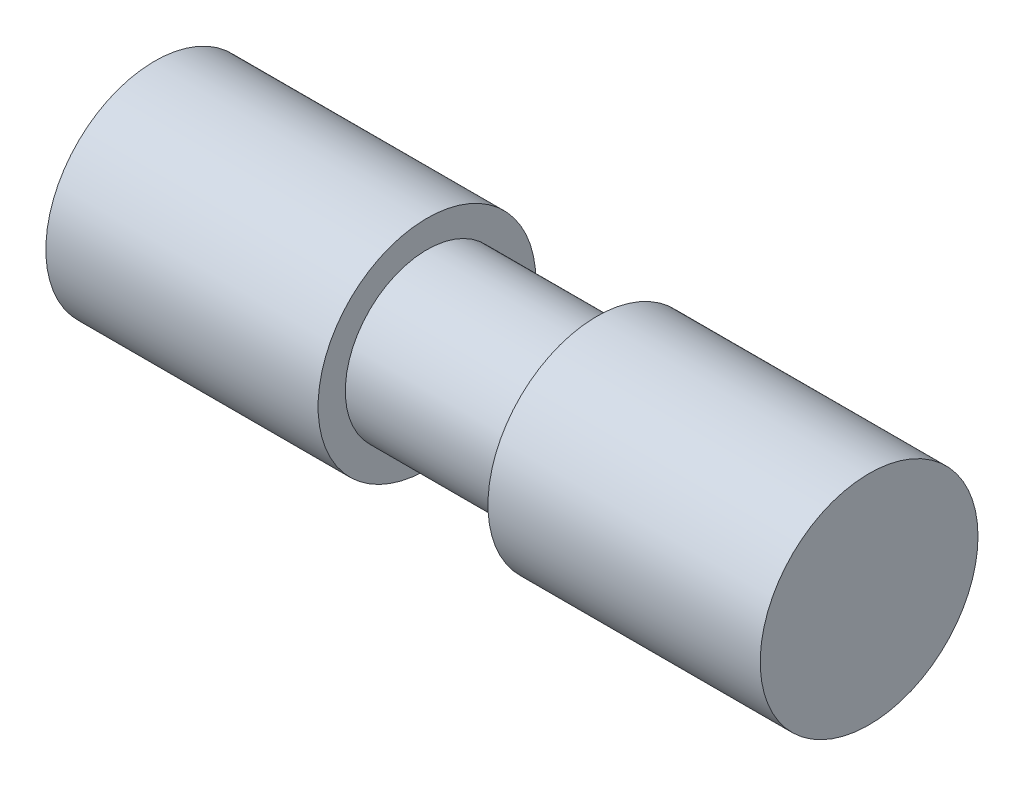
ISO-10303-21;
HEADER;
FILE_DESCRIPTION(('STEP AP214'),'2;1');
FILE_NAME('part.step','',(''),(''),'','','');
FILE_SCHEMA(('AUTOMOTIVE_DESIGN { 1 0 10303 214 1 1 1 1 }'));
ENDSEC;
DATA;
#1=APPLICATION_CONTEXT('core data for automotive mechanical design processes');
#2=APPLICATION_PROTOCOL_DEFINITION('international standard','automotive_design',2000,#1);
#3=PRODUCT_CONTEXT('',#1,'mechanical');
#4=PRODUCT('Part','Part','',(#3));
#5=PRODUCT_RELATED_PRODUCT_CATEGORY('part','',(#4));
#6=PRODUCT_DEFINITION_FORMATION('','',#4);
#7=PRODUCT_DEFINITION_CONTEXT('part definition',#1,'design');
#8=PRODUCT_DEFINITION('design','',#6,#7);
#9=PRODUCT_DEFINITION_SHAPE('','',#8);
#10=(LENGTH_UNIT() NAMED_UNIT(*) SI_UNIT(.MILLI.,.METRE.));
#11=(NAMED_UNIT(*) PLANE_ANGLE_UNIT() SI_UNIT($,.RADIAN.));
#12=(NAMED_UNIT(*) SI_UNIT($,.STERADIAN.) SOLID_ANGLE_UNIT());
#13=UNCERTAINTY_MEASURE_WITH_UNIT(LENGTH_MEASURE(1.E-05),#10,'distance_accuracy_value','');
#14=(GEOMETRIC_REPRESENTATION_CONTEXT(3) GLOBAL_UNCERTAINTY_ASSIGNED_CONTEXT((#13)) GLOBAL_UNIT_ASSIGNED_CONTEXT((#10,
#11,#12)) REPRESENTATION_CONTEXT('',''));
#15=CARTESIAN_POINT('',(0.,0.,0.));
#16=DIRECTION('',(0.,0.,1.));
#17=DIRECTION('',(1.,0.,0.));
#18=AXIS2_PLACEMENT_3D('',#15,#16,#17);
#19=CARTESIAN_POINT('',(50.,0.,0.));
#20=DIRECTION('',(-1.,0.,0.));
#21=DIRECTION('',(0.,0.,1.));
#22=AXIS2_PLACEMENT_3D('',#19,#20,#21);
#23=CYLINDRICAL_SURFACE('',#22,40.);
#24=CARTESIAN_POINT('',(50.,0.,0.));
#25=DIRECTION('',(1.,0.,0.));
#26=DIRECTION('',(0.,0.,-1.));
#27=AXIS2_PLACEMENT_3D('',#24,#25,#26);
#28=CIRCLE('',#27,40.);
#29=CARTESIAN_POINT('',(50.,0.,-40.));
#30=VERTEX_POINT('',#29);
#31=EDGE_CURVE('E10',#30,#30,#28,.T.);
#32=ORIENTED_EDGE('',*,*,#31,.F.);
#33=EDGE_LOOP('',(#32));
#34=FACE_BOUND('',#33,.T.);
#35=CARTESIAN_POINT('',(-50.,0.,0.));
#36=DIRECTION('',(1.,0.,0.));
#37=DIRECTION('',(0.,0.,-1.));
#38=AXIS2_PLACEMENT_3D('',#35,#36,#37);
#39=CIRCLE('',#38,40.);
#40=CARTESIAN_POINT('',(-50.,0.,-40.));
#41=VERTEX_POINT('',#40);
#42=EDGE_CURVE('E37',#41,#41,#39,.T.);
#43=ORIENTED_EDGE('',*,*,#42,.T.);
#44=EDGE_LOOP('',(#43));
#45=FACE_BOUND('',#44,.T.);
#46=ADVANCED_FACE('F34',(#34,#45),#23,.T.);
#47=CARTESIAN_POINT('',(50.,0.,0.));
#48=DIRECTION('',(1.,0.,0.));
#49=DIRECTION('',(0.,0.,-1.));
#50=AXIS2_PLACEMENT_3D('',#47,#48,#49);
#51=PLANE('',#50);
#52=ORIENTED_EDGE('',*,*,#31,.T.);
#53=EDGE_LOOP('',(#52));
#54=FACE_BOUND('',#53,.T.);
#55=ADVANCED_FACE('F76',(#54),#51,.T.);
#56=CARTESIAN_POINT('',(-50.,0.,0.));
#57=DIRECTION('',(1.,0.,0.));
#58=DIRECTION('',(0.,0.,-1.));
#59=AXIS2_PLACEMENT_3D('',#56,#57,#58);
#60=PLANE('',#59);
#61=CARTESIAN_POINT('',(-50.,0.,0.));
#62=DIRECTION('',(1.,0.,0.));
#63=DIRECTION('',(0.,0.,-1.));
#64=AXIS2_PLACEMENT_3D('',#61,#62,#63);
#65=CIRCLE('',#64,30.);
#66=CARTESIAN_POINT('',(-50.,0.,-30.));
#67=VERTEX_POINT('',#66);
#68=EDGE_CURVE('E44',#67,#67,#65,.T.);
#69=ORIENTED_EDGE('',*,*,#68,.T.);
#70=EDGE_LOOP('',(#69));
#71=FACE_BOUND('',#70,.T.);
#72=ORIENTED_EDGE('',*,*,#42,.F.);
#73=EDGE_LOOP('',(#72));
#74=FACE_BOUND('',#73,.T.);
#75=ADVANCED_FACE('F81',(#71,#74),#60,.F.);
#76=CARTESIAN_POINT('',(34.8528137423857,0.,0.));
#77=DIRECTION('',(-1.,0.,0.));
#78=DIRECTION('',(0.,0.,1.));
#79=AXIS2_PLACEMENT_3D('',#76,#77,#78);
#80=CYLINDRICAL_SURFACE('',#79,30.);
#81=CARTESIAN_POINT('',(-112.4,0.,0.));
#82=DIRECTION('',(1.,0.,0.));
#83=DIRECTION('',(0.,0.,-1.));
#84=AXIS2_PLACEMENT_3D('',#81,#82,#83);
#85=CIRCLE('',#84,30.);
#86=CARTESIAN_POINT('',(-112.4,0.,-30.));
#87=VERTEX_POINT('',#86);
#88=EDGE_CURVE('E48',#87,#87,#85,.T.);
#89=ORIENTED_EDGE('',*,*,#88,.T.);
#90=EDGE_LOOP('',(#89));
#91=FACE_BOUND('',#90,.T.);
#92=ORIENTED_EDGE('',*,*,#68,.F.);
#93=EDGE_LOOP('',(#92));
#94=FACE_BOUND('',#93,.T.);
#95=ADVANCED_FACE('F63',(#91,#94),#80,.T.);
#96=CARTESIAN_POINT('',(-112.4,0.,0.));
#97=DIRECTION('',(-1.,0.,0.));
#98=DIRECTION('',(0.,0.,1.));
#99=AXIS2_PLACEMENT_3D('',#96,#97,#98);
#100=CYLINDRICAL_SURFACE('',#99,40.);
#101=CARTESIAN_POINT('',(-112.4,0.,0.));
#102=DIRECTION('',(1.,0.,0.));
#103=DIRECTION('',(0.,0.,-1.));
#104=AXIS2_PLACEMENT_3D('',#101,#102,#103);
#105=CIRCLE('',#104,40.);
#106=CARTESIAN_POINT('',(-112.4,0.,-40.));
#107=VERTEX_POINT('',#106);
#108=EDGE_CURVE('E51',#107,#107,#105,.T.);
#109=ORIENTED_EDGE('',*,*,#108,.F.);
#110=EDGE_LOOP('',(#109));
#111=FACE_BOUND('',#110,.T.);
#112=CARTESIAN_POINT('',(-212.4,0.,0.));
#113=DIRECTION('',(1.,0.,0.));
#114=DIRECTION('',(0.,0.,-1.));
#115=AXIS2_PLACEMENT_3D('',#112,#113,#114);
#116=CIRCLE('',#115,40.);
#117=CARTESIAN_POINT('',(-212.4,0.,-40.));
#118=VERTEX_POINT('',#117);
#119=EDGE_CURVE('E52',#118,#118,#116,.T.);
#120=ORIENTED_EDGE('',*,*,#119,.T.);
#121=EDGE_LOOP('',(#120));
#122=FACE_BOUND('',#121,.T.);
#123=ADVANCED_FACE('F60',(#111,#122),#100,.T.);
#124=CARTESIAN_POINT('',(-112.4,0.,0.));
#125=DIRECTION('',(1.,0.,0.));
#126=DIRECTION('',(0.,0.,-1.));
#127=AXIS2_PLACEMENT_3D('',#124,#125,#126);
#128=PLANE('',#127);
#129=ORIENTED_EDGE('',*,*,#88,.F.);
#130=EDGE_LOOP('',(#129));
#131=FACE_BOUND('',#130,.T.);
#132=ORIENTED_EDGE('',*,*,#108,.T.);
#133=EDGE_LOOP('',(#132));
#134=FACE_BOUND('',#133,.T.);
#135=ADVANCED_FACE('F58',(#131,#134),#128,.T.);
#136=CARTESIAN_POINT('',(-212.4,0.,0.));
#137=DIRECTION('',(1.,0.,0.));
#138=DIRECTION('',(0.,0.,-1.));
#139=AXIS2_PLACEMENT_3D('',#136,#137,#138);
#140=PLANE('',#139);
#141=ORIENTED_EDGE('',*,*,#119,.F.);
#142=EDGE_LOOP('',(#141));
#143=FACE_BOUND('',#142,.T.);
#144=ADVANCED_FACE('F67',(#143),#140,.F.);
#145=CLOSED_SHELL('',(#46,#55,#75,#95,#123,#135,#144));
#146=MANIFOLD_SOLID_BREP('B2',#145);
#147=ADVANCED_BREP_SHAPE_REPRESENTATION('',(#18,#146),#14);
#148=SHAPE_DEFINITION_REPRESENTATION(#9,#147);
ENDSEC;
END-ISO-10303-21;
